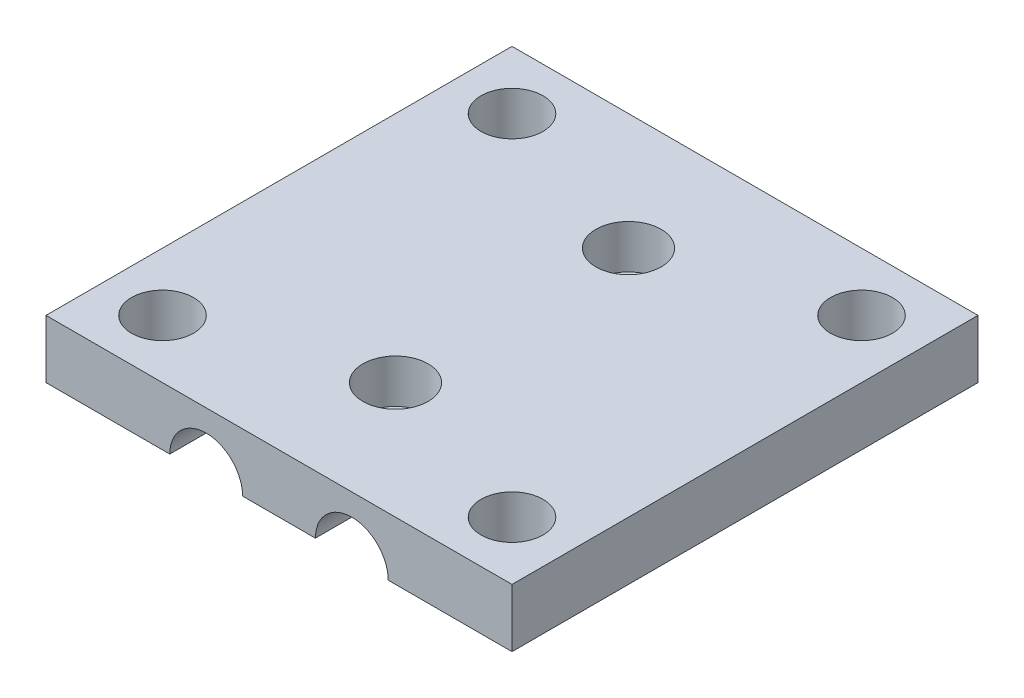
ISO-10303-21;
HEADER;
FILE_DESCRIPTION(('STEP AP214'),'2;1');
FILE_NAME('part.step','',(''),(''),'','','');
FILE_SCHEMA(('AUTOMOTIVE_DESIGN { 1 0 10303 214 1 1 1 1 }'));
ENDSEC;
DATA;
#1=APPLICATION_CONTEXT('core data for automotive mechanical design processes');
#2=APPLICATION_PROTOCOL_DEFINITION('international standard','automotive_design',2000,#1);
#3=PRODUCT_CONTEXT('',#1,'mechanical');
#4=PRODUCT('Part','Part','',(#3));
#5=PRODUCT_RELATED_PRODUCT_CATEGORY('part','',(#4));
#6=PRODUCT_DEFINITION_FORMATION('','',#4);
#7=PRODUCT_DEFINITION_CONTEXT('part definition',#1,'design');
#8=PRODUCT_DEFINITION('design','',#6,#7);
#9=PRODUCT_DEFINITION_SHAPE('','',#8);
#10=(LENGTH_UNIT() NAMED_UNIT(*) SI_UNIT(.MILLI.,.METRE.));
#11=(NAMED_UNIT(*) PLANE_ANGLE_UNIT() SI_UNIT($,.RADIAN.));
#12=(NAMED_UNIT(*) SI_UNIT($,.STERADIAN.) SOLID_ANGLE_UNIT());
#13=UNCERTAINTY_MEASURE_WITH_UNIT(LENGTH_MEASURE(1.E-05),#10,'distance_accuracy_value','');
#14=(GEOMETRIC_REPRESENTATION_CONTEXT(3) GLOBAL_UNCERTAINTY_ASSIGNED_CONTEXT((#13)) GLOBAL_UNIT_ASSIGNED_CONTEXT((#10,
#11,#12)) REPRESENTATION_CONTEXT('',''));
#15=CARTESIAN_POINT('',(0.,0.,0.));
#16=DIRECTION('',(0.,0.,1.));
#17=DIRECTION('',(1.,0.,0.));
#18=AXIS2_PLACEMENT_3D('',#15,#16,#17);
#19=CARTESIAN_POINT('',(0.,6.35,12.7));
#20=DIRECTION('',(0.,1.,0.));
#21=DIRECTION('',(0.,0.,1.));
#22=AXIS2_PLACEMENT_3D('',#19,#20,#21);
#23=CYLINDRICAL_SURFACE('',#22,2.24789999999999);
#24=CARTESIAN_POINT('',(0.,0.,12.7));
#25=DIRECTION('',(0.,1.,0.));
#26=DIRECTION('',(0.,0.,1.));
#27=AXIS2_PLACEMENT_3D('',#24,#25,#26);
#28=CIRCLE('',#27,2.24789999999999);
#29=CARTESIAN_POINT('',(0.,0.,14.9479));
#30=VERTEX_POINT('',#29);
#31=EDGE_CURVE('E161',#30,#30,#28,.T.);
#32=ORIENTED_EDGE('',*,*,#31,.F.);
#33=EDGE_LOOP('',(#32));
#34=FACE_BOUND('',#33,.T.);
#35=CARTESIAN_POINT('',(0.,1.5875,12.7));
#36=DIRECTION('',(0.,1.,0.));
#37=DIRECTION('',(0.,0.,1.));
#38=AXIS2_PLACEMENT_3D('',#35,#36,#37);
#39=CIRCLE('',#38,2.24789999999999);
#40=CARTESIAN_POINT('',(0.,1.5875,14.9479));
#41=VERTEX_POINT('',#40);
#42=EDGE_CURVE('E39',#41,#41,#39,.F.);
#43=ORIENTED_EDGE('',*,*,#42,.F.);
#44=EDGE_LOOP('',(#43));
#45=FACE_BOUND('',#44,.T.);
#46=ADVANCED_FACE('F35',(#34,#45),#23,.F.);
#47=CARTESIAN_POINT('',(0.,6.35,-12.7));
#48=DIRECTION('',(0.,1.,0.));
#49=DIRECTION('',(0.,0.,1.));
#50=AXIS2_PLACEMENT_3D('',#47,#48,#49);
#51=CYLINDRICAL_SURFACE('',#50,2.24789999999999);
#52=CARTESIAN_POINT('',(0.,0.,-12.7));
#53=DIRECTION('',(0.,1.,0.));
#54=DIRECTION('',(0.,0.,1.));
#55=AXIS2_PLACEMENT_3D('',#52,#53,#54);
#56=CIRCLE('',#55,2.24789999999999);
#57=CARTESIAN_POINT('',(0.,0.,-10.4521));
#58=VERTEX_POINT('',#57);
#59=EDGE_CURVE('E156',#58,#58,#56,.T.);
#60=ORIENTED_EDGE('',*,*,#59,.F.);
#61=EDGE_LOOP('',(#60));
#62=FACE_BOUND('',#61,.T.);
#63=CARTESIAN_POINT('',(0.,1.5875,-12.7));
#64=DIRECTION('',(0.,1.,0.));
#65=DIRECTION('',(0.,0.,1.));
#66=AXIS2_PLACEMENT_3D('',#63,#64,#65);
#67=CIRCLE('',#66,2.24789999999999);
#68=CARTESIAN_POINT('',(0.,1.5875,-10.4521));
#69=VERTEX_POINT('',#68);
#70=EDGE_CURVE('E154',#69,#69,#67,.F.);
#71=ORIENTED_EDGE('',*,*,#70,.F.);
#72=EDGE_LOOP('',(#71));
#73=FACE_BOUND('',#72,.T.);
#74=ADVANCED_FACE('F234',(#62,#73),#51,.F.);
#75=CARTESIAN_POINT('',(0.,0.,0.));
#76=DIRECTION('',(0.,1.,0.));
#77=DIRECTION('',(0.,0.,1.));
#78=AXIS2_PLACEMENT_3D('',#75,#76,#77);
#79=PLANE('',#78);
#80=ORIENTED_EDGE('',*,*,#59,.T.);
#81=EDGE_LOOP('',(#80));
#82=FACE_BOUND('',#81,.T.);
#83=ORIENTED_EDGE('',*,*,#31,.T.);
#84=EDGE_LOOP('',(#83));
#85=FACE_BOUND('',#84,.T.);
#86=DIRECTION('',(-1.,0.,0.));
#87=VECTOR('',#86,1.);
#88=CARTESIAN_POINT('',(-25.4,0.,-25.4));
#89=LINE('',#88,#87);
#90=CARTESIAN_POINT('',(3.96875,0.,-25.4));
#91=VERTEX_POINT('',#90);
#92=CARTESIAN_POINT('',(-3.96875,0.,-25.4));
#93=VERTEX_POINT('',#92);
#94=EDGE_CURVE('E59',#91,#93,#89,.T.);
#95=ORIENTED_EDGE('',*,*,#94,.F.);
#96=DIRECTION('',(0.,0.,1.));
#97=VECTOR('',#96,1.);
#98=CARTESIAN_POINT('',(3.96875,0.,-25.4));
#99=LINE('',#98,#97);
#100=CARTESIAN_POINT('',(3.96875,0.,25.4));
#101=VERTEX_POINT('',#100);
#102=EDGE_CURVE('E11',#91,#101,#99,.T.);
#103=ORIENTED_EDGE('',*,*,#102,.T.);
#104=DIRECTION('',(1.,0.,0.));
#105=VECTOR('',#104,1.);
#106=CARTESIAN_POINT('',(-25.4,0.,25.4));
#107=LINE('',#106,#105);
#108=CARTESIAN_POINT('',(-3.96875,0.,25.4));
#109=VERTEX_POINT('',#108);
#110=EDGE_CURVE('E117',#109,#101,#107,.T.);
#111=ORIENTED_EDGE('',*,*,#110,.F.);
#112=DIRECTION('',(0.,0.,1.));
#113=VECTOR('',#112,1.);
#114=CARTESIAN_POINT('',(-3.96875,0.,-25.4));
#115=LINE('',#114,#113);
#116=EDGE_CURVE('E150',#109,#93,#115,.F.);
#117=ORIENTED_EDGE('',*,*,#116,.T.);
#118=EDGE_LOOP('',(#95,#103,#111,#117));
#119=FACE_BOUND('',#118,.T.);
#120=ADVANCED_FACE('F222',(#82,#85,#119),#79,.F.);
#121=CARTESIAN_POINT('',(-19.05,0.,19.05));
#122=DIRECTION('',(0.,1.,0.));
#123=DIRECTION('',(0.,0.,1.));
#124=AXIS2_PLACEMENT_3D('',#121,#122,#123);
#125=CIRCLE('',#124,3.3782);
#126=CARTESIAN_POINT('',(-19.05,0.,22.4282));
#127=VERTEX_POINT('',#126);
#128=EDGE_CURVE('E179',#127,#127,#125,.T.);
#129=ORIENTED_EDGE('',*,*,#128,.T.);
#130=EDGE_LOOP('',(#129));
#131=FACE_BOUND('',#130,.T.);
#132=CARTESIAN_POINT('',(-19.05,0.,-19.05));
#133=DIRECTION('',(0.,1.,0.));
#134=DIRECTION('',(0.,0.,1.));
#135=AXIS2_PLACEMENT_3D('',#132,#133,#134);
#136=CIRCLE('',#135,3.3782);
#137=CARTESIAN_POINT('',(-19.05,0.,-15.6718));
#138=VERTEX_POINT('',#137);
#139=EDGE_CURVE('E185',#138,#138,#136,.T.);
#140=ORIENTED_EDGE('',*,*,#139,.T.);
#141=EDGE_LOOP('',(#140));
#142=FACE_BOUND('',#141,.T.);
#143=CARTESIAN_POINT('',(-11.90625,0.,-25.4));
#144=VERTEX_POINT('',#143);
#145=CARTESIAN_POINT('',(-25.4,0.,-25.4));
#146=VERTEX_POINT('',#145);
#147=EDGE_CURVE('E132',#144,#146,#89,.T.);
#148=ORIENTED_EDGE('',*,*,#147,.F.);
#149=DIRECTION('',(0.,0.,1.));
#150=VECTOR('',#149,1.);
#151=CARTESIAN_POINT('',(-11.90625,0.,-25.4));
#152=LINE('',#151,#150);
#153=CARTESIAN_POINT('',(-11.90625,0.,25.4));
#154=VERTEX_POINT('',#153);
#155=EDGE_CURVE('E107',#144,#154,#152,.T.);
#156=ORIENTED_EDGE('',*,*,#155,.T.);
#157=CARTESIAN_POINT('',(-25.4,0.,25.4));
#158=VERTEX_POINT('',#157);
#159=EDGE_CURVE('E125',#158,#154,#107,.T.);
#160=ORIENTED_EDGE('',*,*,#159,.F.);
#161=DIRECTION('',(0.,0.,1.));
#162=VECTOR('',#161,1.);
#163=CARTESIAN_POINT('',(-25.4,0.,-25.4));
#164=LINE('',#163,#162);
#165=EDGE_CURVE('E123',#146,#158,#164,.T.);
#166=ORIENTED_EDGE('',*,*,#165,.F.);
#167=EDGE_LOOP('',(#148,#156,#160,#166));
#168=FACE_BOUND('',#167,.T.);
#169=ADVANCED_FACE('F226',(#131,#142,#168),#79,.F.);
#170=CARTESIAN_POINT('',(-25.4,6.35,-25.4));
#171=DIRECTION('',(1.,0.,0.));
#172=DIRECTION('',(0.,0.,-1.));
#173=AXIS2_PLACEMENT_3D('',#170,#171,#172);
#174=PLANE('',#173);
#175=ORIENTED_EDGE('',*,*,#165,.T.);
#176=DIRECTION('',(0.,-1.,0.));
#177=VECTOR('',#176,1.);
#178=CARTESIAN_POINT('',(-25.4,6.35,25.4));
#179=LINE('',#178,#177);
#180=CARTESIAN_POINT('',(-25.4,6.35,25.4));
#181=VERTEX_POINT('',#180);
#182=EDGE_CURVE('E148',#181,#158,#179,.T.);
#183=ORIENTED_EDGE('',*,*,#182,.F.);
#184=DIRECTION('',(0.,0.,1.));
#185=VECTOR('',#184,1.);
#186=CARTESIAN_POINT('',(-25.4,6.35,-25.4));
#187=LINE('',#186,#185);
#188=CARTESIAN_POINT('',(-25.4,6.35,-25.4));
#189=VERTEX_POINT('',#188);
#190=EDGE_CURVE('E139',#189,#181,#187,.T.);
#191=ORIENTED_EDGE('',*,*,#190,.F.);
#192=DIRECTION('',(0.,-1.,0.));
#193=VECTOR('',#192,1.);
#194=CARTESIAN_POINT('',(-25.4,6.35,-25.4));
#195=LINE('',#194,#193);
#196=EDGE_CURVE('E140',#189,#146,#195,.T.);
#197=ORIENTED_EDGE('',*,*,#196,.T.);
#198=EDGE_LOOP('',(#175,#183,#191,#197));
#199=FACE_BOUND('',#198,.T.);
#200=ADVANCED_FACE('F37',(#199),#174,.F.);
#201=CARTESIAN_POINT('',(-25.4,6.35,25.4));
#202=DIRECTION('',(0.,0.,-1.));
#203=DIRECTION('',(-1.,0.,0.));
#204=AXIS2_PLACEMENT_3D('',#201,#202,#203);
#205=PLANE('',#204);
#206=ORIENTED_EDGE('',*,*,#110,.T.);
#207=CARTESIAN_POINT('',(7.9375,0.,25.4));
#208=DIRECTION('',(0.,0.,1.));
#209=DIRECTION('',(1.,0.,0.));
#210=AXIS2_PLACEMENT_3D('',#207,#208,#209);
#211=CIRCLE('',#210,3.96875);
#212=CARTESIAN_POINT('',(11.90625,0.,25.4));
#213=VERTEX_POINT('',#212);
#214=EDGE_CURVE('E102',#213,#101,#211,.T.);
#215=ORIENTED_EDGE('',*,*,#214,.F.);
#216=CARTESIAN_POINT('',(25.4,0.,25.4));
#217=VERTEX_POINT('',#216);
#218=EDGE_CURVE('E113',#213,#217,#107,.T.);
#219=ORIENTED_EDGE('',*,*,#218,.T.);
#220=DIRECTION('',(0.,-1.,0.));
#221=VECTOR('',#220,1.);
#222=CARTESIAN_POINT('',(25.4,6.35,25.4));
#223=LINE('',#222,#221);
#224=CARTESIAN_POINT('',(25.4,6.35,25.4));
#225=VERTEX_POINT('',#224);
#226=EDGE_CURVE('E146',#225,#217,#223,.T.);
#227=ORIENTED_EDGE('',*,*,#226,.F.);
#228=DIRECTION('',(1.,0.,0.));
#229=VECTOR('',#228,1.);
#230=CARTESIAN_POINT('',(-25.4,6.35,25.4));
#231=LINE('',#230,#229);
#232=EDGE_CURVE('E205',#181,#225,#231,.T.);
#233=ORIENTED_EDGE('',*,*,#232,.F.);
#234=ORIENTED_EDGE('',*,*,#182,.T.);
#235=ORIENTED_EDGE('',*,*,#159,.T.);
#236=CARTESIAN_POINT('',(-7.9375,0.,25.4));
#237=DIRECTION('',(0.,0.,1.));
#238=DIRECTION('',(1.,0.,0.));
#239=AXIS2_PLACEMENT_3D('',#236,#237,#238);
#240=CIRCLE('',#239,3.96875);
#241=EDGE_CURVE('E199',#109,#154,#240,.T.);
#242=ORIENTED_EDGE('',*,*,#241,.F.);
#243=EDGE_LOOP('',(#206,#215,#219,#227,#233,#234,#235,#242));
#244=FACE_BOUND('',#243,.T.);
#245=ADVANCED_FACE('F111',(#244),#205,.F.);
#246=CARTESIAN_POINT('',(25.4,6.35,-25.4));
#247=DIRECTION('',(-1.,0.,0.));
#248=DIRECTION('',(0.,0.,1.));
#249=AXIS2_PLACEMENT_3D('',#246,#247,#248);
#250=PLANE('',#249);
#251=DIRECTION('',(0.,0.,-1.));
#252=VECTOR('',#251,1.);
#253=CARTESIAN_POINT('',(25.4,0.,-25.4));
#254=LINE('',#253,#252);
#255=CARTESIAN_POINT('',(25.4,0.,-25.4));
#256=VERTEX_POINT('',#255);
#257=EDGE_CURVE('E122',#217,#256,#254,.T.);
#258=ORIENTED_EDGE('',*,*,#257,.T.);
#259=DIRECTION('',(0.,-1.,0.));
#260=VECTOR('',#259,1.);
#261=CARTESIAN_POINT('',(25.4,6.35,-25.4));
#262=LINE('',#261,#260);
#263=CARTESIAN_POINT('',(25.4,6.35,-25.4));
#264=VERTEX_POINT('',#263);
#265=EDGE_CURVE('E143',#264,#256,#262,.T.);
#266=ORIENTED_EDGE('',*,*,#265,.F.);
#267=DIRECTION('',(0.,0.,-1.));
#268=VECTOR('',#267,1.);
#269=CARTESIAN_POINT('',(25.4,6.35,-25.4));
#270=LINE('',#269,#268);
#271=EDGE_CURVE('E207',#225,#264,#270,.T.);
#272=ORIENTED_EDGE('',*,*,#271,.F.);
#273=ORIENTED_EDGE('',*,*,#226,.T.);
#274=EDGE_LOOP('',(#258,#266,#272,#273));
#275=FACE_BOUND('',#274,.T.);
#276=ADVANCED_FACE('F220',(#275),#250,.F.);
#277=CARTESIAN_POINT('',(-25.4,6.35,-25.4));
#278=DIRECTION('',(0.,0.,1.));
#279=DIRECTION('',(1.,0.,0.));
#280=AXIS2_PLACEMENT_3D('',#277,#278,#279);
#281=PLANE('',#280);
#282=CARTESIAN_POINT('',(11.90625,0.,-25.4));
#283=VERTEX_POINT('',#282);
#284=EDGE_CURVE('E137',#256,#283,#89,.T.);
#285=ORIENTED_EDGE('',*,*,#284,.T.);
#286=CARTESIAN_POINT('',(7.9375,0.,-25.4));
#287=DIRECTION('',(0.,0.,1.));
#288=DIRECTION('',(1.,0.,0.));
#289=AXIS2_PLACEMENT_3D('',#286,#287,#288);
#290=CIRCLE('',#289,3.96875);
#291=EDGE_CURVE('E52',#283,#91,#290,.T.);
#292=ORIENTED_EDGE('',*,*,#291,.T.);
#293=ORIENTED_EDGE('',*,*,#94,.T.);
#294=CARTESIAN_POINT('',(-7.9375,0.,-25.4));
#295=DIRECTION('',(0.,0.,1.));
#296=DIRECTION('',(1.,0.,0.));
#297=AXIS2_PLACEMENT_3D('',#294,#295,#296);
#298=CIRCLE('',#297,3.96875);
#299=EDGE_CURVE('E127',#93,#144,#298,.T.);
#300=ORIENTED_EDGE('',*,*,#299,.T.);
#301=ORIENTED_EDGE('',*,*,#147,.T.);
#302=ORIENTED_EDGE('',*,*,#196,.F.);
#303=DIRECTION('',(-1.,0.,0.));
#304=VECTOR('',#303,1.);
#305=CARTESIAN_POINT('',(-25.4,6.35,-25.4));
#306=LINE('',#305,#304);
#307=EDGE_CURVE('E144',#264,#189,#306,.T.);
#308=ORIENTED_EDGE('',*,*,#307,.F.);
#309=ORIENTED_EDGE('',*,*,#265,.T.);
#310=EDGE_LOOP('',(#285,#292,#293,#300,#301,#302,#308,#309));
#311=FACE_BOUND('',#310,.T.);
#312=ADVANCED_FACE('F216',(#311),#281,.F.);
#313=CARTESIAN_POINT('',(0.,6.35,0.));
#314=DIRECTION('',(0.,1.,0.));
#315=DIRECTION('',(0.,0.,1.));
#316=AXIS2_PLACEMENT_3D('',#313,#314,#315);
#317=PLANE('',#316);
#318=CARTESIAN_POINT('',(0.,6.35,12.7));
#319=DIRECTION('',(0.,1.,0.));
#320=DIRECTION('',(0.,0.,1.));
#321=AXIS2_PLACEMENT_3D('',#318,#319,#320);
#322=CIRCLE('',#321,3.556);
#323=CARTESIAN_POINT('',(0.,6.35,16.256));
#324=VERTEX_POINT('',#323);
#325=EDGE_CURVE('E171',#324,#324,#322,.T.);
#326=ORIENTED_EDGE('',*,*,#325,.F.);
#327=EDGE_LOOP('',(#326));
#328=FACE_BOUND('',#327,.T.);
#329=CARTESIAN_POINT('',(0.,6.35,-12.7));
#330=DIRECTION('',(0.,1.,0.));
#331=DIRECTION('',(0.,0.,1.));
#332=AXIS2_PLACEMENT_3D('',#329,#330,#331);
#333=CIRCLE('',#332,3.556);
#334=CARTESIAN_POINT('',(0.,6.35,-9.144));
#335=VERTEX_POINT('',#334);
#336=EDGE_CURVE('E164',#335,#335,#333,.T.);
#337=ORIENTED_EDGE('',*,*,#336,.F.);
#338=EDGE_LOOP('',(#337));
#339=FACE_BOUND('',#338,.T.);
#340=CARTESIAN_POINT('',(-19.05,6.35,19.05));
#341=DIRECTION('',(0.,1.,0.));
#342=DIRECTION('',(0.,0.,1.));
#343=AXIS2_PLACEMENT_3D('',#340,#341,#342);
#344=CIRCLE('',#343,3.3782);
#345=CARTESIAN_POINT('',(-19.05,6.35,22.4282));
#346=VERTEX_POINT('',#345);
#347=EDGE_CURVE('E176',#346,#346,#344,.T.);
#348=ORIENTED_EDGE('',*,*,#347,.F.);
#349=EDGE_LOOP('',(#348));
#350=FACE_BOUND('',#349,.T.);
#351=CARTESIAN_POINT('',(-19.05,6.35,-19.05));
#352=DIRECTION('',(0.,1.,0.));
#353=DIRECTION('',(0.,0.,1.));
#354=AXIS2_PLACEMENT_3D('',#351,#352,#353);
#355=CIRCLE('',#354,3.3782);
#356=CARTESIAN_POINT('',(-19.05,6.35,-15.6718));
#357=VERTEX_POINT('',#356);
#358=EDGE_CURVE('E182',#357,#357,#355,.T.);
#359=ORIENTED_EDGE('',*,*,#358,.F.);
#360=EDGE_LOOP('',(#359));
#361=FACE_BOUND('',#360,.T.);
#362=CARTESIAN_POINT('',(19.05,6.35,-19.05));
#363=DIRECTION('',(0.,1.,0.));
#364=DIRECTION('',(0.,0.,1.));
#365=AXIS2_PLACEMENT_3D('',#362,#363,#364);
#366=CIRCLE('',#365,3.3782);
#367=CARTESIAN_POINT('',(19.05,6.35,-15.6718));
#368=VERTEX_POINT('',#367);
#369=EDGE_CURVE('E188',#368,#368,#366,.T.);
#370=ORIENTED_EDGE('',*,*,#369,.F.);
#371=EDGE_LOOP('',(#370));
#372=FACE_BOUND('',#371,.T.);
#373=CARTESIAN_POINT('',(19.05,6.35,19.05));
#374=DIRECTION('',(0.,1.,0.));
#375=DIRECTION('',(0.,0.,1.));
#376=AXIS2_PLACEMENT_3D('',#373,#374,#375);
#377=CIRCLE('',#376,3.3782);
#378=CARTESIAN_POINT('',(19.05,6.35,22.4282));
#379=VERTEX_POINT('',#378);
#380=EDGE_CURVE('E194',#379,#379,#377,.T.);
#381=ORIENTED_EDGE('',*,*,#380,.F.);
#382=EDGE_LOOP('',(#381));
#383=FACE_BOUND('',#382,.T.);
#384=ORIENTED_EDGE('',*,*,#190,.T.);
#385=ORIENTED_EDGE('',*,*,#232,.T.);
#386=ORIENTED_EDGE('',*,*,#271,.T.);
#387=ORIENTED_EDGE('',*,*,#307,.T.);
#388=EDGE_LOOP('',(#384,#385,#386,#387));
#389=FACE_BOUND('',#388,.T.);
#390=ADVANCED_FACE('F212',(#328,#339,#350,#361,#372,#383,#389),#317,.T.);
#391=CARTESIAN_POINT('',(19.05,0.,-19.05));
#392=DIRECTION('',(0.,1.,0.));
#393=DIRECTION('',(0.,0.,1.));
#394=AXIS2_PLACEMENT_3D('',#391,#392,#393);
#395=CIRCLE('',#394,3.3782);
#396=CARTESIAN_POINT('',(19.05,0.,-15.6718));
#397=VERTEX_POINT('',#396);
#398=EDGE_CURVE('E191',#397,#397,#395,.T.);
#399=ORIENTED_EDGE('',*,*,#398,.T.);
#400=EDGE_LOOP('',(#399));
#401=FACE_BOUND('',#400,.T.);
#402=CARTESIAN_POINT('',(19.05,0.,19.05));
#403=DIRECTION('',(0.,1.,0.));
#404=DIRECTION('',(0.,0.,1.));
#405=AXIS2_PLACEMENT_3D('',#402,#403,#404);
#406=CIRCLE('',#405,3.3782);
#407=CARTESIAN_POINT('',(19.05,0.,22.4282));
#408=VERTEX_POINT('',#407);
#409=EDGE_CURVE('E118',#408,#408,#406,.T.);
#410=ORIENTED_EDGE('',*,*,#409,.T.);
#411=EDGE_LOOP('',(#410));
#412=FACE_BOUND('',#411,.T.);
#413=ORIENTED_EDGE('',*,*,#218,.F.);
#414=DIRECTION('',(0.,0.,1.));
#415=VECTOR('',#414,1.);
#416=CARTESIAN_POINT('',(11.90625,0.,-25.4));
#417=LINE('',#416,#415);
#418=EDGE_CURVE('E44',#213,#283,#417,.F.);
#419=ORIENTED_EDGE('',*,*,#418,.T.);
#420=ORIENTED_EDGE('',*,*,#284,.F.);
#421=ORIENTED_EDGE('',*,*,#257,.F.);
#422=EDGE_LOOP('',(#413,#419,#420,#421));
#423=FACE_BOUND('',#422,.T.);
#424=ADVANCED_FACE('F121',(#401,#412,#423),#79,.F.);
#425=CARTESIAN_POINT('',(-7.9375,0.,-25.4));
#426=DIRECTION('',(0.,0.,1.));
#427=DIRECTION('',(1.,0.,0.));
#428=AXIS2_PLACEMENT_3D('',#425,#426,#427);
#429=CYLINDRICAL_SURFACE('',#428,3.96875);
#430=ORIENTED_EDGE('',*,*,#299,.F.);
#431=ORIENTED_EDGE('',*,*,#116,.F.);
#432=ORIENTED_EDGE('',*,*,#241,.T.);
#433=ORIENTED_EDGE('',*,*,#155,.F.);
#434=EDGE_LOOP('',(#430,#431,#432,#433));
#435=FACE_BOUND('',#434,.T.);
#436=ADVANCED_FACE('F224',(#435),#429,.F.);
#437=CARTESIAN_POINT('',(7.9375,0.,-25.4));
#438=DIRECTION('',(0.,0.,1.));
#439=DIRECTION('',(1.,0.,0.));
#440=AXIS2_PLACEMENT_3D('',#437,#438,#439);
#441=CYLINDRICAL_SURFACE('',#440,3.96875);
#442=ORIENTED_EDGE('',*,*,#291,.F.);
#443=ORIENTED_EDGE('',*,*,#418,.F.);
#444=ORIENTED_EDGE('',*,*,#214,.T.);
#445=ORIENTED_EDGE('',*,*,#102,.F.);
#446=EDGE_LOOP('',(#442,#443,#444,#445));
#447=FACE_BOUND('',#446,.T.);
#448=ADVANCED_FACE('F101',(#447),#441,.F.);
#449=CARTESIAN_POINT('',(19.05,6.35,19.05));
#450=DIRECTION('',(0.,1.,0.));
#451=DIRECTION('',(0.,0.,1.));
#452=AXIS2_PLACEMENT_3D('',#449,#450,#451);
#453=CYLINDRICAL_SURFACE('',#452,3.3782);
#454=ORIENTED_EDGE('',*,*,#409,.F.);
#455=EDGE_LOOP('',(#454));
#456=FACE_BOUND('',#455,.T.);
#457=ORIENTED_EDGE('',*,*,#380,.T.);
#458=EDGE_LOOP('',(#457));
#459=FACE_BOUND('',#458,.T.);
#460=ADVANCED_FACE('F265',(#456,#459),#453,.F.);
#461=CARTESIAN_POINT('',(19.05,6.35,-19.05));
#462=DIRECTION('',(0.,1.,0.));
#463=DIRECTION('',(0.,0.,1.));
#464=AXIS2_PLACEMENT_3D('',#461,#462,#463);
#465=CYLINDRICAL_SURFACE('',#464,3.3782);
#466=ORIENTED_EDGE('',*,*,#398,.F.);
#467=EDGE_LOOP('',(#466));
#468=FACE_BOUND('',#467,.T.);
#469=ORIENTED_EDGE('',*,*,#369,.T.);
#470=EDGE_LOOP('',(#469));
#471=FACE_BOUND('',#470,.T.);
#472=ADVANCED_FACE('F261',(#468,#471),#465,.F.);
#473=CARTESIAN_POINT('',(-19.05,6.35,-19.05));
#474=DIRECTION('',(0.,1.,0.));
#475=DIRECTION('',(0.,0.,1.));
#476=AXIS2_PLACEMENT_3D('',#473,#474,#475);
#477=CYLINDRICAL_SURFACE('',#476,3.3782);
#478=ORIENTED_EDGE('',*,*,#139,.F.);
#479=EDGE_LOOP('',(#478));
#480=FACE_BOUND('',#479,.T.);
#481=ORIENTED_EDGE('',*,*,#358,.T.);
#482=EDGE_LOOP('',(#481));
#483=FACE_BOUND('',#482,.T.);
#484=ADVANCED_FACE('F257',(#480,#483),#477,.F.);
#485=CARTESIAN_POINT('',(-19.05,6.35,19.05));
#486=DIRECTION('',(0.,1.,0.));
#487=DIRECTION('',(0.,0.,1.));
#488=AXIS2_PLACEMENT_3D('',#485,#486,#487);
#489=CYLINDRICAL_SURFACE('',#488,3.3782);
#490=ORIENTED_EDGE('',*,*,#128,.F.);
#491=EDGE_LOOP('',(#490));
#492=FACE_BOUND('',#491,.T.);
#493=ORIENTED_EDGE('',*,*,#347,.T.);
#494=EDGE_LOOP('',(#493));
#495=FACE_BOUND('',#494,.T.);
#496=ADVANCED_FACE('F253',(#492,#495),#489,.F.);
#497=CARTESIAN_POINT('',(0.,1.5875,-12.7));
#498=DIRECTION('',(0.,1.,0.));
#499=DIRECTION('',(0.,0.,1.));
#500=AXIS2_PLACEMENT_3D('',#497,#498,#499);
#501=PLANE('',#500);
#502=CARTESIAN_POINT('',(0.,1.5875,-12.7));
#503=DIRECTION('',(0.,1.,0.));
#504=DIRECTION('',(0.,0.,1.));
#505=AXIS2_PLACEMENT_3D('',#502,#503,#504);
#506=CIRCLE('',#505,3.556);
#507=CARTESIAN_POINT('',(0.,1.5875,-9.144));
#508=VERTEX_POINT('',#507);
#509=EDGE_CURVE('E157',#508,#508,#506,.T.);
#510=ORIENTED_EDGE('',*,*,#509,.T.);
#511=EDGE_LOOP('',(#510));
#512=FACE_BOUND('',#511,.T.);
#513=ORIENTED_EDGE('',*,*,#70,.T.);
#514=EDGE_LOOP('',(#513));
#515=FACE_BOUND('',#514,.T.);
#516=ADVANCED_FACE('F256',(#512,#515),#501,.T.);
#517=CARTESIAN_POINT('',(0.,1.5875,-12.7));
#518=DIRECTION('',(0.,1.,0.));
#519=DIRECTION('',(0.,0.,1.));
#520=AXIS2_PLACEMENT_3D('',#517,#518,#519);
#521=CYLINDRICAL_SURFACE('',#520,3.556);
#522=CARTESIAN_POINT('',(0.,1.5875,-9.144));
#523=CARTESIAN_POINT('',(0.,1.637109375,-9.144));
#524=CARTESIAN_POINT('',(0.,1.68671875,-9.144));
#525=CARTESIAN_POINT('',(0.,1.7859375,-9.144));
#526=CARTESIAN_POINT('',(0.,1.835546875,-9.144));
#527=CARTESIAN_POINT('',(0.,1.934765625,-9.144));
#528=CARTESIAN_POINT('',(0.,1.984375,-9.144));
#529=CARTESIAN_POINT('',(0.,2.08359375,-9.144));
#530=CARTESIAN_POINT('',(0.,2.133203125,-9.144));
#531=CARTESIAN_POINT('',(0.,2.232421875,-9.144));
#532=CARTESIAN_POINT('',(0.,2.28203125,-9.144));
#533=CARTESIAN_POINT('',(0.,2.38125,-9.144));
#534=CARTESIAN_POINT('',(0.,2.430859375,-9.144));
#535=CARTESIAN_POINT('',(0.,2.530078125,-9.144));
#536=CARTESIAN_POINT('',(0.,2.5796875,-9.144));
#537=CARTESIAN_POINT('',(0.,2.67890625,-9.144));
#538=CARTESIAN_POINT('',(0.,2.728515625,-9.144));
#539=CARTESIAN_POINT('',(0.,2.827734375,-9.144));
#540=CARTESIAN_POINT('',(0.,2.87734375,-9.144));
#541=CARTESIAN_POINT('',(0.,2.9765625,-9.144));
#542=CARTESIAN_POINT('',(0.,3.026171875,-9.144));
#543=CARTESIAN_POINT('',(0.,3.125390625,-9.144));
#544=CARTESIAN_POINT('',(0.,3.175,-9.144));
#545=CARTESIAN_POINT('',(0.,3.27421875,-9.144));
#546=CARTESIAN_POINT('',(0.,3.323828125,-9.144));
#547=CARTESIAN_POINT('',(0.,3.423046875,-9.144));
#548=CARTESIAN_POINT('',(0.,3.47265625,-9.144));
#549=CARTESIAN_POINT('',(0.,3.571875,-9.144));
#550=CARTESIAN_POINT('',(0.,3.621484375,-9.144));
#551=CARTESIAN_POINT('',(0.,3.720703125,-9.144));
#552=CARTESIAN_POINT('',(0.,3.7703125,-9.144));
#553=CARTESIAN_POINT('',(0.,3.86953125,-9.144));
#554=CARTESIAN_POINT('',(0.,3.919140625,-9.144));
#555=CARTESIAN_POINT('',(0.,4.018359375,-9.144));
#556=CARTESIAN_POINT('',(0.,4.06796875,-9.144));
#557=CARTESIAN_POINT('',(0.,4.1671875,-9.144));
#558=CARTESIAN_POINT('',(0.,4.216796875,-9.144));
#559=CARTESIAN_POINT('',(0.,4.316015625,-9.144));
#560=CARTESIAN_POINT('',(0.,4.365625,-9.144));
#561=CARTESIAN_POINT('',(0.,4.46484375,-9.144));
#562=CARTESIAN_POINT('',(0.,4.514453125,-9.144));
#563=CARTESIAN_POINT('',(0.,4.613671875,-9.144));
#564=CARTESIAN_POINT('',(0.,4.66328125,-9.144));
#565=CARTESIAN_POINT('',(0.,4.7625,-9.144));
#566=CARTESIAN_POINT('',(0.,4.812109375,-9.144));
#567=CARTESIAN_POINT('',(0.,4.911328125,-9.144));
#568=CARTESIAN_POINT('',(0.,4.9609375,-9.144));
#569=CARTESIAN_POINT('',(0.,5.06015625,-9.144));
#570=CARTESIAN_POINT('',(0.,5.109765625,-9.144));
#571=CARTESIAN_POINT('',(0.,5.208984375,-9.144));
#572=CARTESIAN_POINT('',(0.,5.25859375,-9.144));
#573=CARTESIAN_POINT('',(0.,5.3578125,-9.144));
#574=CARTESIAN_POINT('',(0.,5.407421875,-9.144));
#575=CARTESIAN_POINT('',(0.,5.506640625,-9.144));
#576=CARTESIAN_POINT('',(0.,5.55625,-9.144));
#577=CARTESIAN_POINT('',(0.,5.65546875,-9.144));
#578=CARTESIAN_POINT('',(0.,5.705078125,-9.144));
#579=CARTESIAN_POINT('',(0.,5.804296875,-9.144));
#580=CARTESIAN_POINT('',(0.,5.85390625,-9.144));
#581=CARTESIAN_POINT('',(0.,5.953125,-9.144));
#582=CARTESIAN_POINT('',(0.,6.002734375,-9.144));
#583=CARTESIAN_POINT('',(0.,6.101953125,-9.144));
#584=CARTESIAN_POINT('',(0.,6.1515625,-9.144));
#585=CARTESIAN_POINT('',(0.,6.25078125,-9.144));
#586=CARTESIAN_POINT('',(0.,6.300390625,-9.144));
#587=CARTESIAN_POINT('',(0.,6.35,-9.144));
#588=B_SPLINE_CURVE_WITH_KNOTS('',3,(#522,#523,#524,#525,#526,#527,#528,#529,#530,#531,#532,
#533,#534,#535,#536,#537,#538,#539,#540,#541,#542,#543,#544,#545,#546,#547,#548,#549,#550,#551,
#552,#553,#554,#555,#556,#557,#558,#559,#560,#561,#562,#563,#564,#565,#566,#567,#568,#569,#570,
#571,#572,#573,#574,#575,#576,#577,#578,#579,#580,#581,#582,#583,#584,#585,#586,#587),
.UNSPECIFIED.,.F.,.F.,(4,2,2,2,2,2,2,2,2,2,2,2,2,2,2,2,2,2,2,2,2,2,2,2,2,2,2,2,2,2,2,2,4),(0.,
0.148828125,0.29765625,0.446484375,0.5953125,0.744140625,0.89296875,1.041796875,1.190625,
1.339453125,1.48828125,1.637109375,1.7859375,1.934765625,2.08359375,2.232421875,2.38125,
2.530078125,2.67890625,2.827734375,2.9765625,3.125390625,3.27421875,3.423046875,3.571875,
3.720703125,3.86953125,4.018359375,4.1671875,4.316015625,4.46484375,4.613671875,4.7625),.UNSPECIFIED.);
#589=EDGE_CURVE('BSEAM295',#508,#335,#588,.T.);
#590=ORIENTED_EDGE('',*,*,#509,.F.);
#591=ORIENTED_EDGE('',*,*,#336,.T.);
#592=ORIENTED_EDGE('',*,*,#589,.T.);
#593=ORIENTED_EDGE('',*,*,#589,.F.);
#594=EDGE_LOOP('',(#590,#592,#591,#593));
#595=FACE_BOUND('',#594,.T.);
#596=ADVANCED_FACE('F295',(#595),#521,.F.);
#597=CARTESIAN_POINT('',(0.,1.5875,12.7));
#598=DIRECTION('',(0.,1.,0.));
#599=DIRECTION('',(0.,0.,1.));
#600=AXIS2_PLACEMENT_3D('',#597,#598,#599);
#601=PLANE('',#600);
#602=CARTESIAN_POINT('',(0.,1.5875,12.7));
#603=DIRECTION('',(0.,1.,0.));
#604=DIRECTION('',(0.,0.,1.));
#605=AXIS2_PLACEMENT_3D('',#602,#603,#604);
#606=CIRCLE('',#605,3.556);
#607=CARTESIAN_POINT('',(0.,1.5875,16.256));
#608=VERTEX_POINT('',#607);
#609=EDGE_CURVE('E315',#608,#608,#606,.T.);
#610=ORIENTED_EDGE('',*,*,#609,.T.);
#611=EDGE_LOOP('',(#610));
#612=FACE_BOUND('',#611,.T.);
#613=ORIENTED_EDGE('',*,*,#42,.T.);
#614=EDGE_LOOP('',(#613));
#615=FACE_BOUND('',#614,.T.);
#616=ADVANCED_FACE('F297',(#612,#615),#601,.T.);
#617=CARTESIAN_POINT('',(0.,1.5875,12.7));
#618=DIRECTION('',(0.,1.,0.));
#619=DIRECTION('',(0.,0.,1.));
#620=AXIS2_PLACEMENT_3D('',#617,#618,#619);
#621=CYLINDRICAL_SURFACE('',#620,3.556);
#622=CARTESIAN_POINT('',(0.,1.5875,16.256));
#623=CARTESIAN_POINT('',(0.,1.637109375,16.256));
#624=CARTESIAN_POINT('',(0.,1.68671875,16.256));
#625=CARTESIAN_POINT('',(0.,1.7859375,16.256));
#626=CARTESIAN_POINT('',(0.,1.835546875,16.256));
#627=CARTESIAN_POINT('',(0.,1.934765625,16.256));
#628=CARTESIAN_POINT('',(0.,1.984375,16.256));
#629=CARTESIAN_POINT('',(0.,2.08359375,16.256));
#630=CARTESIAN_POINT('',(0.,2.133203125,16.256));
#631=CARTESIAN_POINT('',(0.,2.232421875,16.256));
#632=CARTESIAN_POINT('',(0.,2.28203125,16.256));
#633=CARTESIAN_POINT('',(0.,2.38125,16.256));
#634=CARTESIAN_POINT('',(0.,2.430859375,16.256));
#635=CARTESIAN_POINT('',(0.,2.530078125,16.256));
#636=CARTESIAN_POINT('',(0.,2.5796875,16.256));
#637=CARTESIAN_POINT('',(0.,2.67890625,16.256));
#638=CARTESIAN_POINT('',(0.,2.728515625,16.256));
#639=CARTESIAN_POINT('',(0.,2.827734375,16.256));
#640=CARTESIAN_POINT('',(0.,2.87734375,16.256));
#641=CARTESIAN_POINT('',(0.,2.9765625,16.256));
#642=CARTESIAN_POINT('',(0.,3.026171875,16.256));
#643=CARTESIAN_POINT('',(0.,3.125390625,16.256));
#644=CARTESIAN_POINT('',(0.,3.175,16.256));
#645=CARTESIAN_POINT('',(0.,3.27421875,16.256));
#646=CARTESIAN_POINT('',(0.,3.323828125,16.256));
#647=CARTESIAN_POINT('',(0.,3.423046875,16.256));
#648=CARTESIAN_POINT('',(0.,3.47265625,16.256));
#649=CARTESIAN_POINT('',(0.,3.571875,16.256));
#650=CARTESIAN_POINT('',(0.,3.621484375,16.256));
#651=CARTESIAN_POINT('',(0.,3.720703125,16.256));
#652=CARTESIAN_POINT('',(0.,3.7703125,16.256));
#653=CARTESIAN_POINT('',(0.,3.86953125,16.256));
#654=CARTESIAN_POINT('',(0.,3.919140625,16.256));
#655=CARTESIAN_POINT('',(0.,4.018359375,16.256));
#656=CARTESIAN_POINT('',(0.,4.06796875,16.256));
#657=CARTESIAN_POINT('',(0.,4.1671875,16.256));
#658=CARTESIAN_POINT('',(0.,4.216796875,16.256));
#659=CARTESIAN_POINT('',(0.,4.316015625,16.256));
#660=CARTESIAN_POINT('',(0.,4.365625,16.256));
#661=CARTESIAN_POINT('',(0.,4.46484375,16.256));
#662=CARTESIAN_POINT('',(0.,4.514453125,16.256));
#663=CARTESIAN_POINT('',(0.,4.613671875,16.256));
#664=CARTESIAN_POINT('',(0.,4.66328125,16.256));
#665=CARTESIAN_POINT('',(0.,4.7625,16.256));
#666=CARTESIAN_POINT('',(0.,4.812109375,16.256));
#667=CARTESIAN_POINT('',(0.,4.911328125,16.256));
#668=CARTESIAN_POINT('',(0.,4.9609375,16.256));
#669=CARTESIAN_POINT('',(0.,5.06015625,16.256));
#670=CARTESIAN_POINT('',(0.,5.109765625,16.256));
#671=CARTESIAN_POINT('',(0.,5.208984375,16.256));
#672=CARTESIAN_POINT('',(0.,5.25859375,16.256));
#673=CARTESIAN_POINT('',(0.,5.3578125,16.256));
#674=CARTESIAN_POINT('',(0.,5.407421875,16.256));
#675=CARTESIAN_POINT('',(0.,5.506640625,16.256));
#676=CARTESIAN_POINT('',(0.,5.55625,16.256));
#677=CARTESIAN_POINT('',(0.,5.65546875,16.256));
#678=CARTESIAN_POINT('',(0.,5.705078125,16.256));
#679=CARTESIAN_POINT('',(0.,5.804296875,16.256));
#680=CARTESIAN_POINT('',(0.,5.85390625,16.256));
#681=CARTESIAN_POINT('',(0.,5.953125,16.256));
#682=CARTESIAN_POINT('',(0.,6.002734375,16.256));
#683=CARTESIAN_POINT('',(0.,6.101953125,16.256));
#684=CARTESIAN_POINT('',(0.,6.1515625,16.256));
#685=CARTESIAN_POINT('',(0.,6.25078125,16.256));
#686=CARTESIAN_POINT('',(0.,6.300390625,16.256));
#687=CARTESIAN_POINT('',(0.,6.35,16.256));
#688=B_SPLINE_CURVE_WITH_KNOTS('',3,(#622,#623,#624,#625,#626,#627,#628,#629,#630,#631,#632,
#633,#634,#635,#636,#637,#638,#639,#640,#641,#642,#643,#644,#645,#646,#647,#648,#649,#650,#651,
#652,#653,#654,#655,#656,#657,#658,#659,#660,#661,#662,#663,#664,#665,#666,#667,#668,#669,#670,
#671,#672,#673,#674,#675,#676,#677,#678,#679,#680,#681,#682,#683,#684,#685,#686,#687),
.UNSPECIFIED.,.F.,.F.,(4,2,2,2,2,2,2,2,2,2,2,2,2,2,2,2,2,2,2,2,2,2,2,2,2,2,2,2,2,2,2,2,4),(0.,
0.148828125,0.29765625,0.446484375,0.5953125,0.744140625,0.89296875,1.041796875,1.190625,
1.339453125,1.48828125,1.637109375,1.7859375,1.934765625,2.08359375,2.232421875,2.38125,
2.530078125,2.67890625,2.827734375,2.9765625,3.125390625,3.27421875,3.423046875,3.571875,
3.720703125,3.86953125,4.018359375,4.1671875,4.316015625,4.46484375,4.613671875,4.7625),.UNSPECIFIED.);
#689=EDGE_CURVE('BSEAM303',#608,#324,#688,.T.);
#690=ORIENTED_EDGE('',*,*,#609,.F.);
#691=ORIENTED_EDGE('',*,*,#325,.T.);
#692=ORIENTED_EDGE('',*,*,#689,.T.);
#693=ORIENTED_EDGE('',*,*,#689,.F.);
#694=EDGE_LOOP('',(#690,#692,#691,#693));
#695=FACE_BOUND('',#694,.T.);
#696=ADVANCED_FACE('F303',(#695),#621,.F.);
#697=CLOSED_SHELL('',(#46,#74,#120,#169,#200,#245,#276,#312,#390,#424,#436,#448,#460,#472,#484,
#496,#516,#596,#616,#696));
#698=MANIFOLD_SOLID_BREP('B2',#697);
#699=ADVANCED_BREP_SHAPE_REPRESENTATION('',(#18,#698),#14);
#700=SHAPE_DEFINITION_REPRESENTATION(#9,#699);
ENDSEC;
END-ISO-10303-21;
